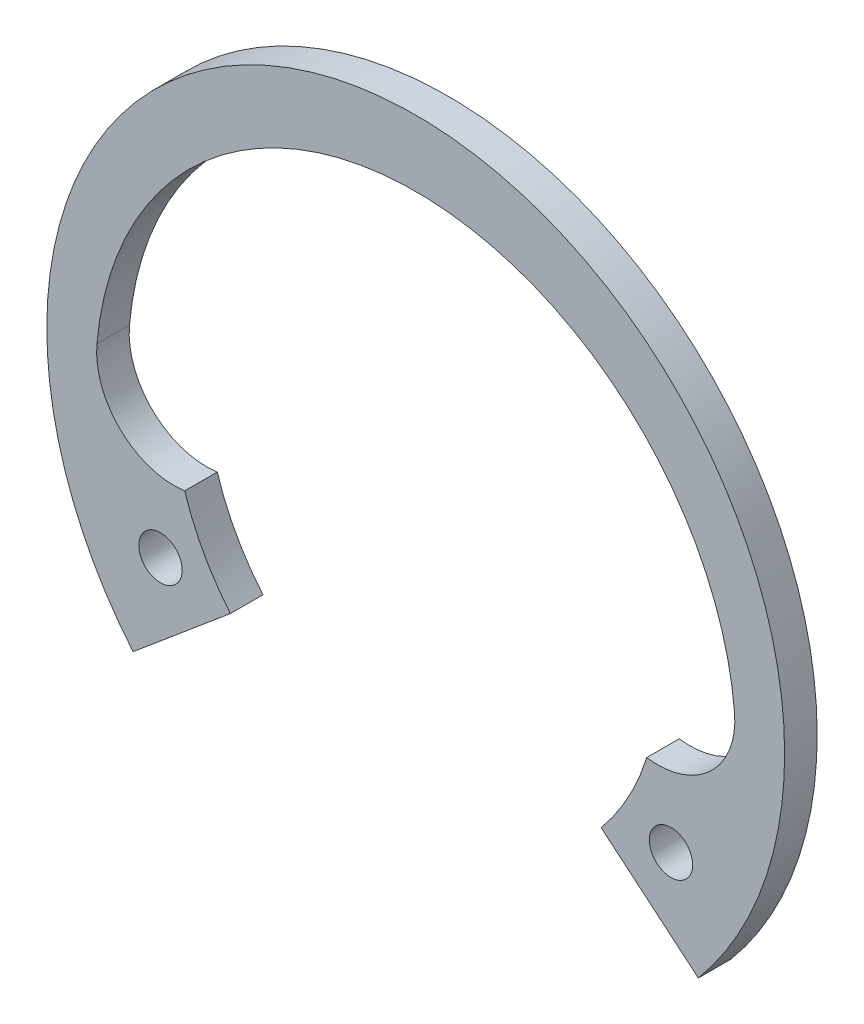
ISO-10303-21;
HEADER;
FILE_DESCRIPTION(('STEP AP214'),'2;1');
FILE_NAME('part.step','',(''),(''),'','','');
FILE_SCHEMA(('AUTOMOTIVE_DESIGN { 1 0 10303 214 1 1 1 1 }'));
ENDSEC;
DATA;
#1=APPLICATION_CONTEXT('core data for automotive mechanical design processes');
#2=APPLICATION_PROTOCOL_DEFINITION('international standard','automotive_design',2000,#1);
#3=PRODUCT_CONTEXT('',#1,'mechanical');
#4=PRODUCT('Part','Part','',(#3));
#5=PRODUCT_RELATED_PRODUCT_CATEGORY('part','',(#4));
#6=PRODUCT_DEFINITION_FORMATION('','',#4);
#7=PRODUCT_DEFINITION_CONTEXT('part definition',#1,'design');
#8=PRODUCT_DEFINITION('design','',#6,#7);
#9=PRODUCT_DEFINITION_SHAPE('','',#8);
#10=(LENGTH_UNIT() NAMED_UNIT(*) SI_UNIT(.MILLI.,.METRE.));
#11=(NAMED_UNIT(*) PLANE_ANGLE_UNIT() SI_UNIT($,.RADIAN.));
#12=(NAMED_UNIT(*) SI_UNIT($,.STERADIAN.) SOLID_ANGLE_UNIT());
#13=UNCERTAINTY_MEASURE_WITH_UNIT(LENGTH_MEASURE(1.E-05),#10,'distance_accuracy_value','');
#14=(GEOMETRIC_REPRESENTATION_CONTEXT(3) GLOBAL_UNCERTAINTY_ASSIGNED_CONTEXT((#13)) GLOBAL_UNIT_ASSIGNED_CONTEXT((#10,
#11,#12)) REPRESENTATION_CONTEXT('',''));
#15=CARTESIAN_POINT('',(0.,0.,0.));
#16=DIRECTION('',(0.,0.,1.));
#17=DIRECTION('',(1.,0.,0.));
#18=AXIS2_PLACEMENT_3D('',#15,#16,#17);
#19=CARTESIAN_POINT('',(0.,0.,1.5));
#20=DIRECTION('',(0.,0.,-1.));
#21=DIRECTION('',(-1.,0.,0.));
#22=AXIS2_PLACEMENT_3D('',#19,#20,#21);
#23=PLANE('',#22);
#24=CARTESIAN_POINT('',(-11.7623241686881,-6.54738936467115,1.5));
#25=DIRECTION('',(0.,0.,1.));
#26=DIRECTION('',(1.,0.,0.));
#27=AXIS2_PLACEMENT_3D('',#24,#25,#26);
#28=CIRCLE('',#27,1.);
#29=CARTESIAN_POINT('',(-10.7623241686881,-6.54738936467115,1.5));
#30=VERTEX_POINT('',#29);
#31=EDGE_CURVE('E133',#30,#30,#28,.T.);
#32=ORIENTED_EDGE('',*,*,#31,.F.);
#33=EDGE_LOOP('',(#32));
#34=FACE_BOUND('',#33,.T.);
#35=CARTESIAN_POINT('',(0.,0.,1.5));
#36=DIRECTION('',(0.,0.,1.));
#37=DIRECTION('',(-1.,0.,0.));
#38=AXIS2_PLACEMENT_3D('',#35,#36,#37);
#39=CIRCLE('',#38,17.);
#40=CARTESIAN_POINT('',(13.0227555330226,-10.9273893646711,1.5));
#41=VERTEX_POINT('',#40);
#42=CARTESIAN_POINT('',(-13.0227555330226,-10.9273893646711,1.5));
#43=VERTEX_POINT('',#42);
#44=EDGE_CURVE('E144',#41,#43,#39,.T.);
#45=ORIENTED_EDGE('',*,*,#44,.T.);
#46=DIRECTION('',(0.766044443118979,0.642787609686538,0.));
#47=VECTOR('',#46,1.);
#48=CARTESIAN_POINT('',(-13.0227555330226,-10.9273893646711,1.5));
#49=LINE('',#48,#47);
#50=CARTESIAN_POINT('',(-8.54139554077661,-7.1670818480049,1.5));
#51=VERTEX_POINT('',#50);
#52=EDGE_CURVE('E92',#43,#51,#49,.T.);
#53=ORIENTED_EDGE('',*,*,#52,.T.);
#54=CARTESIAN_POINT('',(0.,0.,1.5));
#55=DIRECTION('',(0.,0.,-1.));
#56=DIRECTION('',(-1.,0.,0.));
#57=AXIS2_PLACEMENT_3D('',#54,#55,#56);
#58=CIRCLE('',#57,11.15);
#59=CARTESIAN_POINT('',(-10.6443548952195,-3.31966999333032,1.5));
#60=VERTEX_POINT('',#59);
#61=EDGE_CURVE('E159',#51,#60,#58,.T.);
#62=ORIENTED_EDGE('',*,*,#61,.T.);
#63=CARTESIAN_POINT('',(-11.1481809281698,0.201400081407239,1.5));
#64=DIRECTION('',(0.,0.,-1.));
#65=DIRECTION('',(-1.,0.,0.));
#66=AXIS2_PLACEMENT_3D('',#63,#64,#65);
#67=CIRCLE('',#66,3.55693339025218);
#68=CARTESIAN_POINT('',(-14.6908505437912,0.519625060382764,1.5));
#69=VERTEX_POINT('',#68);
#70=EDGE_CURVE('E172',#60,#69,#67,.T.);
#71=ORIENTED_EDGE('',*,*,#70,.T.);
#72=CARTESIAN_POINT('',(0.,-0.799999999999999,1.5));
#73=DIRECTION('',(0.,0.,-1.));
#74=DIRECTION('',(-1.,0.,0.));
#75=AXIS2_PLACEMENT_3D('',#72,#73,#74);
#76=CIRCLE('',#75,14.75);
#77=CARTESIAN_POINT('',(14.6908505437912,0.51962506038277,1.5));
#78=VERTEX_POINT('',#77);
#79=EDGE_CURVE('E111',#69,#78,#76,.T.);
#80=ORIENTED_EDGE('',*,*,#79,.T.);
#81=CARTESIAN_POINT('',(11.1481809281698,0.201400081407241,1.5));
#82=DIRECTION('',(0.,0.,-1.));
#83=DIRECTION('',(1.,0.,0.));
#84=AXIS2_PLACEMENT_3D('',#81,#82,#83);
#85=CIRCLE('',#84,3.55693339025218);
#86=CARTESIAN_POINT('',(10.6443548952195,-3.31966999333031,1.5));
#87=VERTEX_POINT('',#86);
#88=EDGE_CURVE('E105',#78,#87,#85,.T.);
#89=ORIENTED_EDGE('',*,*,#88,.T.);
#90=CARTESIAN_POINT('',(0.,0.,1.5));
#91=DIRECTION('',(0.,0.,-1.));
#92=DIRECTION('',(1.,0.,0.));
#93=AXIS2_PLACEMENT_3D('',#90,#91,#92);
#94=CIRCLE('',#93,11.15);
#95=CARTESIAN_POINT('',(8.54139554077662,-7.1670818480049,1.5));
#96=VERTEX_POINT('',#95);
#97=EDGE_CURVE('E109',#87,#96,#94,.T.);
#98=ORIENTED_EDGE('',*,*,#97,.T.);
#99=DIRECTION('',(0.766044443118979,-0.642787609686538,0.));
#100=VECTOR('',#99,1.);
#101=CARTESIAN_POINT('',(13.0227555330226,-10.9273893646711,1.5));
#102=LINE('',#101,#100);
#103=EDGE_CURVE('E49',#96,#41,#102,.T.);
#104=ORIENTED_EDGE('',*,*,#103,.T.);
#105=EDGE_LOOP('',(#45,#53,#62,#71,#80,#89,#98,#104));
#106=FACE_BOUND('',#105,.T.);
#107=CARTESIAN_POINT('',(11.7623241686881,-6.54738936467115,1.5));
#108=DIRECTION('',(0.,0.,1.));
#109=DIRECTION('',(-1.,0.,0.));
#110=AXIS2_PLACEMENT_3D('',#107,#108,#109);
#111=CIRCLE('',#110,1.);
#112=CARTESIAN_POINT('',(10.7623241686881,-6.54738936467115,1.5));
#113=VERTEX_POINT('',#112);
#114=EDGE_CURVE('E181',#113,#113,#111,.T.);
#115=ORIENTED_EDGE('',*,*,#114,.F.);
#116=EDGE_LOOP('',(#115));
#117=FACE_BOUND('',#116,.T.);
#118=ADVANCED_FACE('F32',(#34,#106,#117),#23,.F.);
#119=CARTESIAN_POINT('',(0.,0.,0.));
#120=DIRECTION('',(0.,0.,-1.));
#121=DIRECTION('',(-1.,0.,0.));
#122=AXIS2_PLACEMENT_3D('',#119,#120,#121);
#123=PLANE('',#122);
#124=CARTESIAN_POINT('',(-11.7623241686881,-6.54738936467115,0.));
#125=DIRECTION('',(0.,0.,1.));
#126=DIRECTION('',(1.,0.,0.));
#127=AXIS2_PLACEMENT_3D('',#124,#125,#126);
#128=CIRCLE('',#127,1.);
#129=CARTESIAN_POINT('',(-10.7623241686881,-6.54738936467115,0.));
#130=VERTEX_POINT('',#129);
#131=EDGE_CURVE('E178',#130,#130,#128,.T.);
#132=ORIENTED_EDGE('',*,*,#131,.T.);
#133=EDGE_LOOP('',(#132));
#134=FACE_BOUND('',#133,.T.);
#135=CARTESIAN_POINT('',(0.,0.,0.));
#136=DIRECTION('',(0.,0.,1.));
#137=DIRECTION('',(-1.,0.,0.));
#138=AXIS2_PLACEMENT_3D('',#135,#136,#137);
#139=CIRCLE('',#138,17.);
#140=CARTESIAN_POINT('',(13.0227555330226,-10.9273893646711,0.));
#141=VERTEX_POINT('',#140);
#142=CARTESIAN_POINT('',(-13.0227555330226,-10.9273893646711,0.));
#143=VERTEX_POINT('',#142);
#144=EDGE_CURVE('E129',#141,#143,#139,.T.);
#145=ORIENTED_EDGE('',*,*,#144,.F.);
#146=DIRECTION('',(0.766044443118979,-0.642787609686538,0.));
#147=VECTOR('',#146,1.);
#148=CARTESIAN_POINT('',(13.0227555330226,-10.9273893646711,0.));
#149=LINE('',#148,#147);
#150=CARTESIAN_POINT('',(8.54139554077662,-7.1670818480049,0.));
#151=VERTEX_POINT('',#150);
#152=EDGE_CURVE('E84',#151,#141,#149,.T.);
#153=ORIENTED_EDGE('',*,*,#152,.F.);
#154=CARTESIAN_POINT('',(0.,0.,0.));
#155=DIRECTION('',(0.,0.,-1.));
#156=DIRECTION('',(1.,0.,0.));
#157=AXIS2_PLACEMENT_3D('',#154,#155,#156);
#158=CIRCLE('',#157,11.15);
#159=CARTESIAN_POINT('',(10.6443548952195,-3.31966999333031,0.));
#160=VERTEX_POINT('',#159);
#161=EDGE_CURVE('E78',#160,#151,#158,.T.);
#162=ORIENTED_EDGE('',*,*,#161,.F.);
#163=CARTESIAN_POINT('',(11.1481809281698,0.201400081407241,0.));
#164=DIRECTION('',(0.,0.,-1.));
#165=DIRECTION('',(1.,0.,0.));
#166=AXIS2_PLACEMENT_3D('',#163,#164,#165);
#167=CIRCLE('',#166,3.55693339025218);
#168=CARTESIAN_POINT('',(14.6908505437912,0.51962506038277,0.));
#169=VERTEX_POINT('',#168);
#170=EDGE_CURVE('E119',#169,#160,#167,.T.);
#171=ORIENTED_EDGE('',*,*,#170,.F.);
#172=CARTESIAN_POINT('',(0.,-0.799999999999999,0.));
#173=DIRECTION('',(0.,0.,-1.));
#174=DIRECTION('',(-1.,0.,0.));
#175=AXIS2_PLACEMENT_3D('',#172,#173,#174);
#176=CIRCLE('',#175,14.75);
#177=CARTESIAN_POINT('',(-14.6908505437912,0.519625060382764,0.));
#178=VERTEX_POINT('',#177);
#179=EDGE_CURVE('E139',#178,#169,#176,.T.);
#180=ORIENTED_EDGE('',*,*,#179,.F.);
#181=CARTESIAN_POINT('',(-11.1481809281698,0.201400081407239,0.));
#182=DIRECTION('',(0.,0.,-1.));
#183=DIRECTION('',(-1.,0.,0.));
#184=AXIS2_PLACEMENT_3D('',#181,#182,#183);
#185=CIRCLE('',#184,3.55693339025218);
#186=CARTESIAN_POINT('',(-10.6443548952195,-3.31966999333032,0.));
#187=VERTEX_POINT('',#186);
#188=EDGE_CURVE('E137',#187,#178,#185,.T.);
#189=ORIENTED_EDGE('',*,*,#188,.F.);
#190=CARTESIAN_POINT('',(0.,0.,0.));
#191=DIRECTION('',(0.,0.,-1.));
#192=DIRECTION('',(-1.,0.,0.));
#193=AXIS2_PLACEMENT_3D('',#190,#191,#192);
#194=CIRCLE('',#193,11.15);
#195=CARTESIAN_POINT('',(-8.54139554077661,-7.1670818480049,0.));
#196=VERTEX_POINT('',#195);
#197=EDGE_CURVE('E135',#196,#187,#194,.T.);
#198=ORIENTED_EDGE('',*,*,#197,.F.);
#199=DIRECTION('',(0.766044443118979,0.642787609686538,0.));
#200=VECTOR('',#199,1.);
#201=CARTESIAN_POINT('',(-13.0227555330226,-10.9273893646711,0.));
#202=LINE('',#201,#200);
#203=EDGE_CURVE('E132',#143,#196,#202,.T.);
#204=ORIENTED_EDGE('',*,*,#203,.F.);
#205=EDGE_LOOP('',(#145,#153,#162,#171,#180,#189,#198,#204));
#206=FACE_BOUND('',#205,.T.);
#207=CARTESIAN_POINT('',(11.7623241686881,-6.54738936467115,0.));
#208=DIRECTION('',(0.,0.,1.));
#209=DIRECTION('',(-1.,0.,0.));
#210=AXIS2_PLACEMENT_3D('',#207,#208,#209);
#211=CIRCLE('',#210,1.);
#212=CARTESIAN_POINT('',(10.7623241686881,-6.54738936467115,0.));
#213=VERTEX_POINT('',#212);
#214=EDGE_CURVE('E184',#213,#213,#211,.T.);
#215=ORIENTED_EDGE('',*,*,#214,.T.);
#216=EDGE_LOOP('',(#215));
#217=FACE_BOUND('',#216,.T.);
#218=ADVANCED_FACE('F163',(#134,#206,#217),#123,.T.);
#219=CARTESIAN_POINT('',(0.,0.,1.5));
#220=DIRECTION('',(0.,0.,-1.));
#221=DIRECTION('',(-1.,0.,0.));
#222=AXIS2_PLACEMENT_3D('',#219,#220,#221);
#223=CYLINDRICAL_SURFACE('',#222,17.);
#224=ORIENTED_EDGE('',*,*,#144,.T.);
#225=DIRECTION('',(0.,0.,-1.));
#226=VECTOR('',#225,1.);
#227=CARTESIAN_POINT('',(-13.0227555330226,-10.9273893646711,1.5));
#228=LINE('',#227,#226);
#229=EDGE_CURVE('E11',#43,#143,#228,.T.);
#230=ORIENTED_EDGE('',*,*,#229,.F.);
#231=ORIENTED_EDGE('',*,*,#44,.F.);
#232=DIRECTION('',(0.,0.,-1.));
#233=VECTOR('',#232,1.);
#234=CARTESIAN_POINT('',(13.0227555330226,-10.9273893646711,1.5));
#235=LINE('',#234,#233);
#236=EDGE_CURVE('E125',#41,#141,#235,.T.);
#237=ORIENTED_EDGE('',*,*,#236,.T.);
#238=EDGE_LOOP('',(#224,#230,#231,#237));
#239=FACE_BOUND('',#238,.T.);
#240=ADVANCED_FACE('F34',(#239),#223,.T.);
#241=CARTESIAN_POINT('',(-13.0227555330226,-10.9273893646711,1.5));
#242=DIRECTION('',(-0.642787609686538,0.766044443118979,0.));
#243=DIRECTION('',(-0.766044443118979,-0.642787609686538,0.));
#244=AXIS2_PLACEMENT_3D('',#241,#242,#243);
#245=PLANE('',#244);
#246=ORIENTED_EDGE('',*,*,#203,.T.);
#247=DIRECTION('',(0.,0.,-1.));
#248=VECTOR('',#247,1.);
#249=CARTESIAN_POINT('',(-8.54139554077661,-7.1670818480049,1.5));
#250=LINE('',#249,#248);
#251=EDGE_CURVE('E41',#51,#196,#250,.T.);
#252=ORIENTED_EDGE('',*,*,#251,.F.);
#253=ORIENTED_EDGE('',*,*,#52,.F.);
#254=ORIENTED_EDGE('',*,*,#229,.T.);
#255=EDGE_LOOP('',(#246,#252,#253,#254));
#256=FACE_BOUND('',#255,.T.);
#257=ADVANCED_FACE('F217',(#256),#245,.F.);
#258=CARTESIAN_POINT('',(0.,0.,1.5));
#259=DIRECTION('',(0.,0.,-1.));
#260=DIRECTION('',(-1.,0.,0.));
#261=AXIS2_PLACEMENT_3D('',#258,#259,#260);
#262=CYLINDRICAL_SURFACE('',#261,11.15);
#263=ORIENTED_EDGE('',*,*,#197,.T.);
#264=DIRECTION('',(0.,0.,-1.));
#265=VECTOR('',#264,1.);
#266=CARTESIAN_POINT('',(-10.6443548952195,-3.31966999333032,1.5));
#267=LINE('',#266,#265);
#268=EDGE_CURVE('E151',#60,#187,#267,.T.);
#269=ORIENTED_EDGE('',*,*,#268,.F.);
#270=ORIENTED_EDGE('',*,*,#61,.F.);
#271=ORIENTED_EDGE('',*,*,#251,.T.);
#272=EDGE_LOOP('',(#263,#269,#270,#271));
#273=FACE_BOUND('',#272,.T.);
#274=ADVANCED_FACE('F157',(#273),#262,.F.);
#275=CARTESIAN_POINT('',(-11.1481809281698,0.201400081407239,1.5));
#276=DIRECTION('',(0.,0.,-1.));
#277=DIRECTION('',(-1.,0.,0.));
#278=AXIS2_PLACEMENT_3D('',#275,#276,#277);
#279=CYLINDRICAL_SURFACE('',#278,3.55693339025218);
#280=ORIENTED_EDGE('',*,*,#188,.T.);
#281=DIRECTION('',(0.,0.,-1.));
#282=VECTOR('',#281,1.);
#283=CARTESIAN_POINT('',(-14.6908505437912,0.519625060382764,1.5));
#284=LINE('',#283,#282);
#285=EDGE_CURVE('E148',#69,#178,#284,.T.);
#286=ORIENTED_EDGE('',*,*,#285,.F.);
#287=ORIENTED_EDGE('',*,*,#70,.F.);
#288=ORIENTED_EDGE('',*,*,#268,.T.);
#289=EDGE_LOOP('',(#280,#286,#287,#288));
#290=FACE_BOUND('',#289,.T.);
#291=ADVANCED_FACE('F168',(#290),#279,.F.);
#292=CARTESIAN_POINT('',(0.,-0.799999999999999,1.5));
#293=DIRECTION('',(0.,0.,-1.));
#294=DIRECTION('',(-1.,0.,0.));
#295=AXIS2_PLACEMENT_3D('',#292,#293,#294);
#296=CYLINDRICAL_SURFACE('',#295,14.75);
#297=ORIENTED_EDGE('',*,*,#179,.T.);
#298=DIRECTION('',(0.,0.,-1.));
#299=VECTOR('',#298,1.);
#300=CARTESIAN_POINT('',(14.6908505437912,0.51962506038277,1.5));
#301=LINE('',#300,#299);
#302=EDGE_CURVE('E120',#78,#169,#301,.T.);
#303=ORIENTED_EDGE('',*,*,#302,.F.);
#304=ORIENTED_EDGE('',*,*,#79,.F.);
#305=ORIENTED_EDGE('',*,*,#285,.T.);
#306=EDGE_LOOP('',(#297,#303,#304,#305));
#307=FACE_BOUND('',#306,.T.);
#308=ADVANCED_FACE('F171',(#307),#296,.F.);
#309=CARTESIAN_POINT('',(11.1481809281698,0.201400081407241,1.5));
#310=DIRECTION('',(0.,0.,-1.));
#311=DIRECTION('',(-1.,0.,0.));
#312=AXIS2_PLACEMENT_3D('',#309,#310,#311);
#313=CYLINDRICAL_SURFACE('',#312,3.55693339025218);
#314=ORIENTED_EDGE('',*,*,#170,.T.);
#315=DIRECTION('',(0.,0.,-1.));
#316=VECTOR('',#315,1.);
#317=CARTESIAN_POINT('',(10.6443548952195,-3.31966999333031,1.5));
#318=LINE('',#317,#316);
#319=EDGE_CURVE('E116',#87,#160,#318,.T.);
#320=ORIENTED_EDGE('',*,*,#319,.F.);
#321=ORIENTED_EDGE('',*,*,#88,.F.);
#322=ORIENTED_EDGE('',*,*,#302,.T.);
#323=EDGE_LOOP('',(#314,#320,#321,#322));
#324=FACE_BOUND('',#323,.T.);
#325=ADVANCED_FACE('F117',(#324),#313,.F.);
#326=CARTESIAN_POINT('',(0.,0.,1.5));
#327=DIRECTION('',(0.,0.,-1.));
#328=DIRECTION('',(-1.,0.,0.));
#329=AXIS2_PLACEMENT_3D('',#326,#327,#328);
#330=CYLINDRICAL_SURFACE('',#329,11.15);
#331=ORIENTED_EDGE('',*,*,#161,.T.);
#332=DIRECTION('',(0.,0.,-1.));
#333=VECTOR('',#332,1.);
#334=CARTESIAN_POINT('',(8.54139554077662,-7.1670818480049,1.5));
#335=LINE('',#334,#333);
#336=EDGE_CURVE('E121',#96,#151,#335,.T.);
#337=ORIENTED_EDGE('',*,*,#336,.F.);
#338=ORIENTED_EDGE('',*,*,#97,.F.);
#339=ORIENTED_EDGE('',*,*,#319,.T.);
#340=EDGE_LOOP('',(#331,#337,#338,#339));
#341=FACE_BOUND('',#340,.T.);
#342=ADVANCED_FACE('F123',(#341),#330,.F.);
#343=CARTESIAN_POINT('',(13.0227555330226,-10.9273893646711,1.5));
#344=DIRECTION('',(0.642787609686538,0.766044443118979,0.));
#345=DIRECTION('',(-0.766044443118979,0.642787609686538,0.));
#346=AXIS2_PLACEMENT_3D('',#343,#344,#345);
#347=PLANE('',#346);
#348=ORIENTED_EDGE('',*,*,#152,.T.);
#349=ORIENTED_EDGE('',*,*,#236,.F.);
#350=ORIENTED_EDGE('',*,*,#103,.F.);
#351=ORIENTED_EDGE('',*,*,#336,.T.);
#352=EDGE_LOOP('',(#348,#349,#350,#351));
#353=FACE_BOUND('',#352,.T.);
#354=ADVANCED_FACE('F205',(#353),#347,.F.);
#355=CARTESIAN_POINT('',(-11.7623241686881,-6.54738936467115,1.5));
#356=DIRECTION('',(0.,0.,-1.));
#357=DIRECTION('',(-1.,0.,0.));
#358=AXIS2_PLACEMENT_3D('',#355,#356,#357);
#359=CYLINDRICAL_SURFACE('',#358,1.);
#360=ORIENTED_EDGE('',*,*,#31,.T.);
#361=EDGE_LOOP('',(#360));
#362=FACE_BOUND('',#361,.T.);
#363=ORIENTED_EDGE('',*,*,#131,.F.);
#364=EDGE_LOOP('',(#363));
#365=FACE_BOUND('',#364,.T.);
#366=ADVANCED_FACE('F202',(#362,#365),#359,.F.);
#367=CARTESIAN_POINT('',(11.7623241686881,-6.54738936467115,1.5));
#368=DIRECTION('',(0.,0.,-1.));
#369=DIRECTION('',(-1.,0.,0.));
#370=AXIS2_PLACEMENT_3D('',#367,#368,#369);
#371=CYLINDRICAL_SURFACE('',#370,1.);
#372=ORIENTED_EDGE('',*,*,#114,.T.);
#373=EDGE_LOOP('',(#372));
#374=FACE_BOUND('',#373,.T.);
#375=ORIENTED_EDGE('',*,*,#214,.F.);
#376=EDGE_LOOP('',(#375));
#377=FACE_BOUND('',#376,.T.);
#378=ADVANCED_FACE('F190',(#374,#377),#371,.F.);
#379=CLOSED_SHELL('',(#118,#218,#240,#257,#274,#291,#308,#325,#342,#354,#366,#378));
#380=MANIFOLD_SOLID_BREP('B2',#379);
#381=ADVANCED_BREP_SHAPE_REPRESENTATION('',(#18,#380),#14);
#382=SHAPE_DEFINITION_REPRESENTATION(#9,#381);
ENDSEC;
END-ISO-10303-21;
